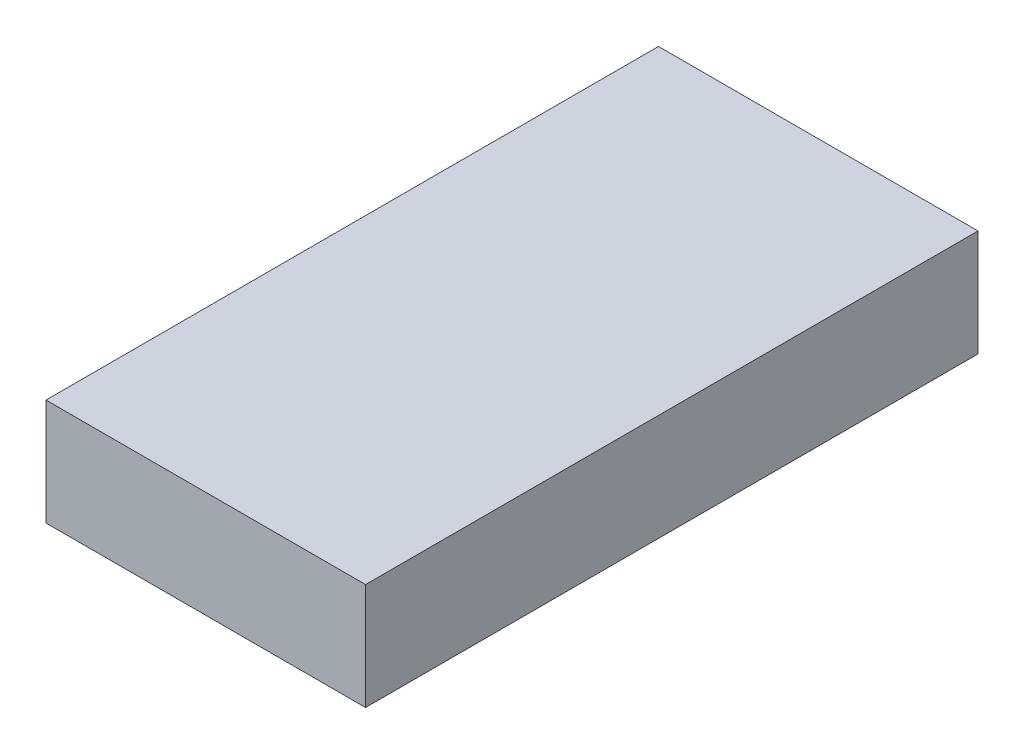
ISO-10303-21;
HEADER;
FILE_DESCRIPTION(('STEP AP214'),'2;1');
FILE_NAME('part.step','',(''),(''),'','','');
FILE_SCHEMA(('AUTOMOTIVE_DESIGN { 1 0 10303 214 1 1 1 1 }'));
ENDSEC;
DATA;
#1=APPLICATION_CONTEXT('core data for automotive mechanical design processes');
#2=APPLICATION_PROTOCOL_DEFINITION('international standard','automotive_design',2000,#1);
#3=PRODUCT_CONTEXT('',#1,'mechanical');
#4=PRODUCT('Part','Part','',(#3));
#5=PRODUCT_RELATED_PRODUCT_CATEGORY('part','',(#4));
#6=PRODUCT_DEFINITION_FORMATION('','',#4);
#7=PRODUCT_DEFINITION_CONTEXT('part definition',#1,'design');
#8=PRODUCT_DEFINITION('design','',#6,#7);
#9=PRODUCT_DEFINITION_SHAPE('','',#8);
#10=(LENGTH_UNIT() NAMED_UNIT(*) SI_UNIT(.MILLI.,.METRE.));
#11=(NAMED_UNIT(*) PLANE_ANGLE_UNIT() SI_UNIT($,.RADIAN.));
#12=(NAMED_UNIT(*) SI_UNIT($,.STERADIAN.) SOLID_ANGLE_UNIT());
#13=UNCERTAINTY_MEASURE_WITH_UNIT(LENGTH_MEASURE(1.E-05),#10,'distance_accuracy_value','');
#14=(GEOMETRIC_REPRESENTATION_CONTEXT(3) GLOBAL_UNCERTAINTY_ASSIGNED_CONTEXT((#13)) GLOBAL_UNIT_ASSIGNED_CONTEXT((#10,
#11,#12)) REPRESENTATION_CONTEXT('',''));
#15=CARTESIAN_POINT('',(0.,0.,0.));
#16=DIRECTION('',(0.,0.,1.));
#17=DIRECTION('',(1.,0.,0.));
#18=AXIS2_PLACEMENT_3D('',#15,#16,#17);
#19=CARTESIAN_POINT('',(0.,20.,0.));
#20=DIRECTION('',(1.,0.,0.));
#21=DIRECTION('',(0.,0.,-1.));
#22=AXIS2_PLACEMENT_3D('',#19,#20,#21);
#23=PLANE('',#22);
#24=DIRECTION('',(0.,0.,1.));
#25=VECTOR('',#24,1.);
#26=CARTESIAN_POINT('',(0.,0.,0.));
#27=LINE('',#26,#25);
#28=CARTESIAN_POINT('',(0.,0.,-115.));
#29=VERTEX_POINT('',#28);
#30=CARTESIAN_POINT('',(0.,0.,0.));
#31=VERTEX_POINT('',#30);
#32=EDGE_CURVE('E96',#29,#31,#27,.T.);
#33=ORIENTED_EDGE('',*,*,#32,.T.);
#34=DIRECTION('',(0.,-1.,0.));
#35=VECTOR('',#34,1.);
#36=CARTESIAN_POINT('',(0.,20.,0.));
#37=LINE('',#36,#35);
#38=CARTESIAN_POINT('',(0.,20.,0.));
#39=VERTEX_POINT('',#38);
#40=EDGE_CURVE('E11',#39,#31,#37,.T.);
#41=ORIENTED_EDGE('',*,*,#40,.F.);
#42=DIRECTION('',(0.,0.,1.));
#43=VECTOR('',#42,1.);
#44=CARTESIAN_POINT('',(0.,20.,0.));
#45=LINE('',#44,#43);
#46=CARTESIAN_POINT('',(0.,20.,-115.));
#47=VERTEX_POINT('',#46);
#48=EDGE_CURVE('E84',#47,#39,#45,.T.);
#49=ORIENTED_EDGE('',*,*,#48,.F.);
#50=DIRECTION('',(0.,-1.,0.));
#51=VECTOR('',#50,1.);
#52=CARTESIAN_POINT('',(0.,20.,-115.));
#53=LINE('',#52,#51);
#54=EDGE_CURVE('E92',#47,#29,#53,.T.);
#55=ORIENTED_EDGE('',*,*,#54,.T.);
#56=EDGE_LOOP('',(#33,#41,#49,#55));
#57=FACE_BOUND('',#56,.T.);
#58=ADVANCED_FACE('F33',(#57),#23,.F.);
#59=CARTESIAN_POINT('',(0.,20.,0.));
#60=DIRECTION('',(0.,0.,-1.));
#61=DIRECTION('',(-1.,0.,0.));
#62=AXIS2_PLACEMENT_3D('',#59,#60,#61);
#63=PLANE('',#62);
#64=DIRECTION('',(1.,0.,0.));
#65=VECTOR('',#64,1.);
#66=CARTESIAN_POINT('',(0.,0.,0.));
#67=LINE('',#66,#65);
#68=CARTESIAN_POINT('',(60.,0.,0.));
#69=VERTEX_POINT('',#68);
#70=EDGE_CURVE('E88',#31,#69,#67,.T.);
#71=ORIENTED_EDGE('',*,*,#70,.T.);
#72=DIRECTION('',(0.,-1.,0.));
#73=VECTOR('',#72,1.);
#74=CARTESIAN_POINT('',(60.,20.,0.));
#75=LINE('',#74,#73);
#76=CARTESIAN_POINT('',(60.,20.,0.));
#77=VERTEX_POINT('',#76);
#78=EDGE_CURVE('E41',#77,#69,#75,.T.);
#79=ORIENTED_EDGE('',*,*,#78,.F.);
#80=DIRECTION('',(1.,0.,0.));
#81=VECTOR('',#80,1.);
#82=CARTESIAN_POINT('',(0.,20.,0.));
#83=LINE('',#82,#81);
#84=EDGE_CURVE('E79',#39,#77,#83,.T.);
#85=ORIENTED_EDGE('',*,*,#84,.F.);
#86=ORIENTED_EDGE('',*,*,#40,.T.);
#87=EDGE_LOOP('',(#71,#79,#85,#86));
#88=FACE_BOUND('',#87,.T.);
#89=ADVANCED_FACE('F87',(#88),#63,.F.);
#90=CARTESIAN_POINT('',(60.,20.,0.));
#91=DIRECTION('',(-1.,0.,0.));
#92=DIRECTION('',(0.,0.,1.));
#93=AXIS2_PLACEMENT_3D('',#90,#91,#92);
#94=PLANE('',#93);
#95=DIRECTION('',(0.,0.,-1.));
#96=VECTOR('',#95,1.);
#97=CARTESIAN_POINT('',(60.,0.,0.));
#98=LINE('',#97,#96);
#99=CARTESIAN_POINT('',(60.,0.,-115.));
#100=VERTEX_POINT('',#99);
#101=EDGE_CURVE('E66',#69,#100,#98,.T.);
#102=ORIENTED_EDGE('',*,*,#101,.T.);
#103=DIRECTION('',(0.,-1.,0.));
#104=VECTOR('',#103,1.);
#105=CARTESIAN_POINT('',(60.,20.,-115.));
#106=LINE('',#105,#104);
#107=CARTESIAN_POINT('',(60.,20.,-115.));
#108=VERTEX_POINT('',#107);
#109=EDGE_CURVE('E89',#108,#100,#106,.T.);
#110=ORIENTED_EDGE('',*,*,#109,.F.);
#111=DIRECTION('',(0.,0.,-1.));
#112=VECTOR('',#111,1.);
#113=CARTESIAN_POINT('',(60.,20.,0.));
#114=LINE('',#113,#112);
#115=EDGE_CURVE('E82',#77,#108,#114,.T.);
#116=ORIENTED_EDGE('',*,*,#115,.F.);
#117=ORIENTED_EDGE('',*,*,#78,.T.);
#118=EDGE_LOOP('',(#102,#110,#116,#117));
#119=FACE_BOUND('',#118,.T.);
#120=ADVANCED_FACE('F90',(#119),#94,.F.);
#121=CARTESIAN_POINT('',(0.,20.,-115.));
#122=DIRECTION('',(0.,0.,1.));
#123=DIRECTION('',(1.,0.,0.));
#124=AXIS2_PLACEMENT_3D('',#121,#122,#123);
#125=PLANE('',#124);
#126=DIRECTION('',(-1.,0.,0.));
#127=VECTOR('',#126,1.);
#128=CARTESIAN_POINT('',(0.,0.,-115.));
#129=LINE('',#128,#127);
#130=EDGE_CURVE('E72',#100,#29,#129,.T.);
#131=ORIENTED_EDGE('',*,*,#130,.T.);
#132=ORIENTED_EDGE('',*,*,#54,.F.);
#133=DIRECTION('',(-1.,0.,0.));
#134=VECTOR('',#133,1.);
#135=CARTESIAN_POINT('',(0.,20.,-115.));
#136=LINE('',#135,#134);
#137=EDGE_CURVE('E49',#108,#47,#136,.T.);
#138=ORIENTED_EDGE('',*,*,#137,.F.);
#139=ORIENTED_EDGE('',*,*,#109,.T.);
#140=EDGE_LOOP('',(#131,#132,#138,#139));
#141=FACE_BOUND('',#140,.T.);
#142=ADVANCED_FACE('F103',(#141),#125,.F.);
#143=CARTESIAN_POINT('',(0.,20.,0.));
#144=DIRECTION('',(0.,-1.,0.));
#145=DIRECTION('',(0.,0.,-1.));
#146=AXIS2_PLACEMENT_3D('',#143,#144,#145);
#147=PLANE('',#146);
#148=ORIENTED_EDGE('',*,*,#48,.T.);
#149=ORIENTED_EDGE('',*,*,#84,.T.);
#150=ORIENTED_EDGE('',*,*,#115,.T.);
#151=ORIENTED_EDGE('',*,*,#137,.T.);
#152=EDGE_LOOP('',(#148,#149,#150,#151));
#153=FACE_BOUND('',#152,.T.);
#154=ADVANCED_FACE('F80',(#153),#147,.F.);
#155=CARTESIAN_POINT('',(0.,0.,0.));
#156=DIRECTION('',(0.,-1.,0.));
#157=DIRECTION('',(0.,0.,-1.));
#158=AXIS2_PLACEMENT_3D('',#155,#156,#157);
#159=PLANE('',#158);
#160=ORIENTED_EDGE('',*,*,#32,.F.);
#161=ORIENTED_EDGE('',*,*,#130,.F.);
#162=ORIENTED_EDGE('',*,*,#101,.F.);
#163=ORIENTED_EDGE('',*,*,#70,.F.);
#164=EDGE_LOOP('',(#160,#161,#162,#163));
#165=FACE_BOUND('',#164,.T.);
#166=ADVANCED_FACE('F106',(#165),#159,.T.);
#167=CLOSED_SHELL('',(#58,#89,#120,#142,#154,#166));
#168=MANIFOLD_SOLID_BREP('B2',#167);
#169=ADVANCED_BREP_SHAPE_REPRESENTATION('',(#18,#168),#14);
#170=SHAPE_DEFINITION_REPRESENTATION(#9,#169);
ENDSEC;
END-ISO-10303-21;
